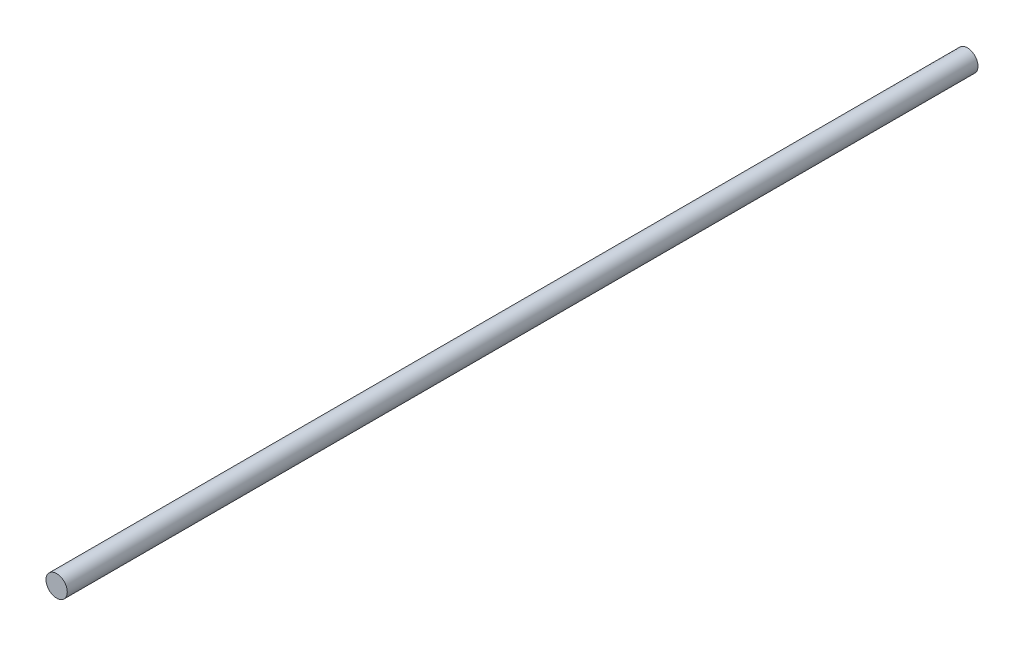
ISO-10303-21;
HEADER;
FILE_DESCRIPTION(('STEP AP214'),'2;1');
FILE_NAME('part.step','',(''),(''),'','','');
FILE_SCHEMA(('AUTOMOTIVE_DESIGN { 1 0 10303 214 1 1 1 1 }'));
ENDSEC;
DATA;
#1=APPLICATION_CONTEXT('core data for automotive mechanical design processes');
#2=APPLICATION_PROTOCOL_DEFINITION('international standard','automotive_design',2000,#1);
#3=PRODUCT_CONTEXT('',#1,'mechanical');
#4=PRODUCT('Part','Part','',(#3));
#5=PRODUCT_RELATED_PRODUCT_CATEGORY('part','',(#4));
#6=PRODUCT_DEFINITION_FORMATION('','',#4);
#7=PRODUCT_DEFINITION_CONTEXT('part definition',#1,'design');
#8=PRODUCT_DEFINITION('design','',#6,#7);
#9=PRODUCT_DEFINITION_SHAPE('','',#8);
#10=(LENGTH_UNIT() NAMED_UNIT(*) SI_UNIT(.MILLI.,.METRE.));
#11=(NAMED_UNIT(*) PLANE_ANGLE_UNIT() SI_UNIT($,.RADIAN.));
#12=(NAMED_UNIT(*) SI_UNIT($,.STERADIAN.) SOLID_ANGLE_UNIT());
#13=UNCERTAINTY_MEASURE_WITH_UNIT(LENGTH_MEASURE(1.E-05),#10,'distance_accuracy_value','');
#14=(GEOMETRIC_REPRESENTATION_CONTEXT(3) GLOBAL_UNCERTAINTY_ASSIGNED_CONTEXT((#13)) GLOBAL_UNIT_ASSIGNED_CONTEXT((#10,
#11,#12)) REPRESENTATION_CONTEXT('',''));
#15=CARTESIAN_POINT('',(0.,0.,0.));
#16=DIRECTION('',(0.,0.,1.));
#17=DIRECTION('',(1.,0.,0.));
#18=AXIS2_PLACEMENT_3D('',#15,#16,#17);
#19=CARTESIAN_POINT('',(0.,0.,342.));
#20=DIRECTION('',(0.,0.,-1.));
#21=DIRECTION('',(-1.,0.,0.));
#22=AXIS2_PLACEMENT_3D('',#19,#20,#21);
#23=CYLINDRICAL_SURFACE('',#22,4.);
#24=CARTESIAN_POINT('',(0.,0.,342.));
#25=DIRECTION('',(0.,0.,1.));
#26=DIRECTION('',(1.,0.,0.));
#27=AXIS2_PLACEMENT_3D('',#24,#25,#26);
#28=CIRCLE('',#27,4.);
#29=CARTESIAN_POINT('',(4.,0.,342.));
#30=VERTEX_POINT('',#29);
#31=EDGE_CURVE('E10',#30,#30,#28,.T.);
#32=ORIENTED_EDGE('',*,*,#31,.F.);
#33=EDGE_LOOP('',(#32));
#34=FACE_BOUND('',#33,.T.);
#35=CARTESIAN_POINT('',(0.,0.,0.));
#36=DIRECTION('',(0.,0.,1.));
#37=DIRECTION('',(1.,0.,0.));
#38=AXIS2_PLACEMENT_3D('',#35,#36,#37);
#39=CIRCLE('',#38,4.);
#40=CARTESIAN_POINT('',(4.,0.,0.));
#41=VERTEX_POINT('',#40);
#42=EDGE_CURVE('E35',#41,#41,#39,.T.);
#43=ORIENTED_EDGE('',*,*,#42,.T.);
#44=EDGE_LOOP('',(#43));
#45=FACE_BOUND('',#44,.T.);
#46=ADVANCED_FACE('F32',(#34,#45),#23,.T.);
#47=CARTESIAN_POINT('',(0.,0.,342.));
#48=DIRECTION('',(0.,0.,1.));
#49=DIRECTION('',(1.,0.,0.));
#50=AXIS2_PLACEMENT_3D('',#47,#48,#49);
#51=PLANE('',#50);
#52=ORIENTED_EDGE('',*,*,#31,.T.);
#53=EDGE_LOOP('',(#52));
#54=FACE_BOUND('',#53,.T.);
#55=ADVANCED_FACE('F47',(#54),#51,.T.);
#56=CARTESIAN_POINT('',(0.,0.,0.));
#57=DIRECTION('',(0.,0.,1.));
#58=DIRECTION('',(1.,0.,0.));
#59=AXIS2_PLACEMENT_3D('',#56,#57,#58);
#60=PLANE('',#59);
#61=ORIENTED_EDGE('',*,*,#42,.F.);
#62=EDGE_LOOP('',(#61));
#63=FACE_BOUND('',#62,.T.);
#64=ADVANCED_FACE('F45',(#63),#60,.F.);
#65=CLOSED_SHELL('',(#46,#55,#64));
#66=MANIFOLD_SOLID_BREP('B2',#65);
#67=ADVANCED_BREP_SHAPE_REPRESENTATION('',(#18,#66),#14);
#68=SHAPE_DEFINITION_REPRESENTATION(#9,#67);
ENDSEC;
END-ISO-10303-21;
